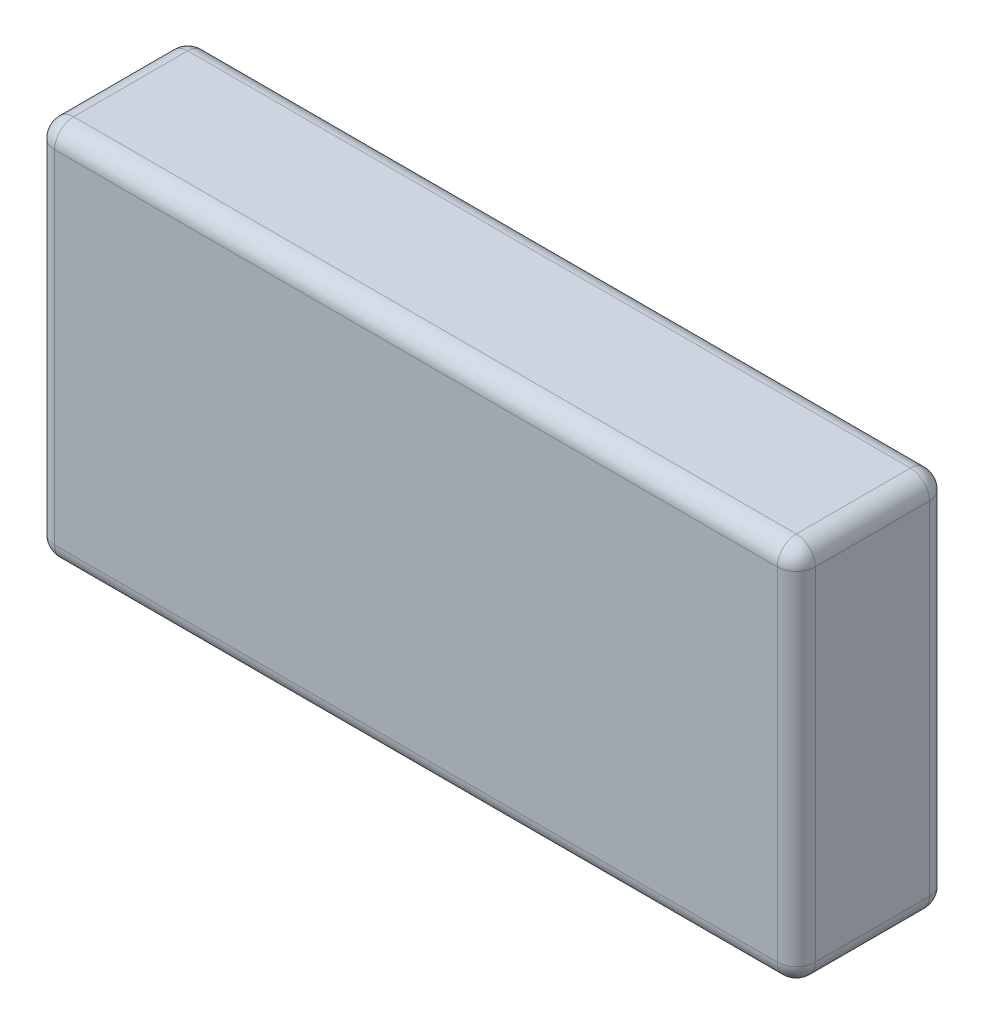
ISO-10303-21;
HEADER;
FILE_DESCRIPTION(('STEP AP214'),'2;1');
FILE_NAME('part.step','',(''),(''),'','','');
FILE_SCHEMA(('AUTOMOTIVE_DESIGN { 1 0 10303 214 1 1 1 1 }'));
ENDSEC;
DATA;
#1=APPLICATION_CONTEXT('core data for automotive mechanical design processes');
#2=APPLICATION_PROTOCOL_DEFINITION('international standard','automotive_design',2000,#1);
#3=PRODUCT_CONTEXT('',#1,'mechanical');
#4=PRODUCT('Part','Part','',(#3));
#5=PRODUCT_RELATED_PRODUCT_CATEGORY('part','',(#4));
#6=PRODUCT_DEFINITION_FORMATION('','',#4);
#7=PRODUCT_DEFINITION_CONTEXT('part definition',#1,'design');
#8=PRODUCT_DEFINITION('design','',#6,#7);
#9=PRODUCT_DEFINITION_SHAPE('','',#8);
#10=(LENGTH_UNIT() NAMED_UNIT(*) SI_UNIT(.MILLI.,.METRE.));
#11=(NAMED_UNIT(*) PLANE_ANGLE_UNIT() SI_UNIT($,.RADIAN.));
#12=(NAMED_UNIT(*) SI_UNIT($,.STERADIAN.) SOLID_ANGLE_UNIT());
#13=UNCERTAINTY_MEASURE_WITH_UNIT(LENGTH_MEASURE(1.E-05),#10,'distance_accuracy_value','');
#14=(GEOMETRIC_REPRESENTATION_CONTEXT(3) GLOBAL_UNCERTAINTY_ASSIGNED_CONTEXT((#13)) GLOBAL_UNIT_ASSIGNED_CONTEXT((#10,
#11,#12)) REPRESENTATION_CONTEXT('',''));
#15=CARTESIAN_POINT('',(0.,0.,0.));
#16=DIRECTION('',(0.,0.,1.));
#17=DIRECTION('',(1.,0.,0.));
#18=AXIS2_PLACEMENT_3D('',#15,#16,#17);
#19=CARTESIAN_POINT('',(5.,5.,-1.));
#20=DIRECTION('',(-1.,0.,0.));
#21=DIRECTION('',(0.,0.,1.));
#22=AXIS2_PLACEMENT_3D('',#19,#20,#21);
#23=PLANE('',#22);
#24=DIRECTION('',(0.,0.,-1.));
#25=VECTOR('',#24,1.);
#26=CARTESIAN_POINT('',(5.,0.25,-1.));
#27=LINE('',#26,#25);
#28=CARTESIAN_POINT('',(5.,0.25,0.75));
#29=VERTEX_POINT('',#28);
#30=CARTESIAN_POINT('',(5.,0.25,-0.75));
#31=VERTEX_POINT('',#30);
#32=EDGE_CURVE('E139',#29,#31,#27,.T.);
#33=ORIENTED_EDGE('',*,*,#32,.T.);
#34=DIRECTION('',(0.,-1.,0.));
#35=VECTOR('',#34,1.);
#36=CARTESIAN_POINT('',(5.,5.,-0.75));
#37=LINE('',#36,#35);
#38=CARTESIAN_POINT('',(5.,4.75,-0.75));
#39=VERTEX_POINT('',#38);
#40=EDGE_CURVE('E135',#31,#39,#37,.F.);
#41=ORIENTED_EDGE('',*,*,#40,.T.);
#42=DIRECTION('',(0.,0.,-1.));
#43=VECTOR('',#42,1.);
#44=CARTESIAN_POINT('',(5.,4.75,1.));
#45=LINE('',#44,#43);
#46=CARTESIAN_POINT('',(5.,4.75,0.75));
#47=VERTEX_POINT('',#46);
#48=EDGE_CURVE('E128',#39,#47,#45,.F.);
#49=ORIENTED_EDGE('',*,*,#48,.T.);
#50=DIRECTION('',(0.,-1.,0.));
#51=VECTOR('',#50,1.);
#52=CARTESIAN_POINT('',(5.,5.,0.75));
#53=LINE('',#52,#51);
#54=EDGE_CURVE('E132',#47,#29,#53,.T.);
#55=ORIENTED_EDGE('',*,*,#54,.T.);
#56=EDGE_LOOP('',(#33,#41,#49,#55));
#57=FACE_BOUND('',#56,.T.);
#58=ADVANCED_FACE('F41',(#57),#23,.F.);
#59=CARTESIAN_POINT('',(-5.,5.,-1.));
#60=DIRECTION('',(0.,0.,1.));
#61=DIRECTION('',(1.,0.,0.));
#62=AXIS2_PLACEMENT_3D('',#59,#60,#61);
#63=PLANE('',#62);
#64=DIRECTION('',(-1.,0.,0.));
#65=VECTOR('',#64,1.);
#66=CARTESIAN_POINT('',(5.,4.75,-1.));
#67=LINE('',#66,#65);
#68=CARTESIAN_POINT('',(-4.75,4.75,-1.));
#69=VERTEX_POINT('',#68);
#70=CARTESIAN_POINT('',(4.75,4.75,-1.));
#71=VERTEX_POINT('',#70);
#72=EDGE_CURVE('E200',#69,#71,#67,.F.);
#73=ORIENTED_EDGE('',*,*,#72,.T.);
#74=DIRECTION('',(0.,-1.,0.));
#75=VECTOR('',#74,1.);
#76=CARTESIAN_POINT('',(4.75,5.,-1.));
#77=LINE('',#76,#75);
#78=CARTESIAN_POINT('',(4.75,0.25,-1.));
#79=VERTEX_POINT('',#78);
#80=EDGE_CURVE('E202',#71,#79,#77,.T.);
#81=ORIENTED_EDGE('',*,*,#80,.T.);
#82=DIRECTION('',(-1.,0.,0.));
#83=VECTOR('',#82,1.);
#84=CARTESIAN_POINT('',(-5.,0.25,-1.));
#85=LINE('',#84,#83);
#86=CARTESIAN_POINT('',(-4.75,0.25,-1.));
#87=VERTEX_POINT('',#86);
#88=EDGE_CURVE('E196',#79,#87,#85,.T.);
#89=ORIENTED_EDGE('',*,*,#88,.T.);
#90=DIRECTION('',(0.,-1.,0.));
#91=VECTOR('',#90,1.);
#92=CARTESIAN_POINT('',(-4.75,5.,-1.));
#93=LINE('',#92,#91);
#94=EDGE_CURVE('E198',#87,#69,#93,.F.);
#95=ORIENTED_EDGE('',*,*,#94,.T.);
#96=EDGE_LOOP('',(#73,#81,#89,#95));
#97=FACE_BOUND('',#96,.T.);
#98=ADVANCED_FACE('F271',(#97),#63,.F.);
#99=CARTESIAN_POINT('',(-5.,5.,-1.));
#100=DIRECTION('',(1.,0.,0.));
#101=DIRECTION('',(0.,0.,-1.));
#102=AXIS2_PLACEMENT_3D('',#99,#100,#101);
#103=PLANE('',#102);
#104=DIRECTION('',(0.,0.,1.));
#105=VECTOR('',#104,1.);
#106=CARTESIAN_POINT('',(-5.,4.75,-1.));
#107=LINE('',#106,#105);
#108=CARTESIAN_POINT('',(-5.,4.75,0.75));
#109=VERTEX_POINT('',#108);
#110=CARTESIAN_POINT('',(-5.,4.75,-0.75));
#111=VERTEX_POINT('',#110);
#112=EDGE_CURVE('E191',#109,#111,#107,.F.);
#113=ORIENTED_EDGE('',*,*,#112,.T.);
#114=DIRECTION('',(0.,-1.,0.));
#115=VECTOR('',#114,1.);
#116=CARTESIAN_POINT('',(-5.,5.,-0.75));
#117=LINE('',#116,#115);
#118=CARTESIAN_POINT('',(-5.,0.25,-0.75));
#119=VERTEX_POINT('',#118);
#120=EDGE_CURVE('E194',#111,#119,#117,.T.);
#121=ORIENTED_EDGE('',*,*,#120,.T.);
#122=DIRECTION('',(0.,0.,1.));
#123=VECTOR('',#122,1.);
#124=CARTESIAN_POINT('',(-5.,0.25,-1.));
#125=LINE('',#124,#123);
#126=CARTESIAN_POINT('',(-5.,0.25,0.75));
#127=VERTEX_POINT('',#126);
#128=EDGE_CURVE('E189',#119,#127,#125,.T.);
#129=ORIENTED_EDGE('',*,*,#128,.T.);
#130=DIRECTION('',(0.,-1.,0.));
#131=VECTOR('',#130,1.);
#132=CARTESIAN_POINT('',(-5.,5.,0.75));
#133=LINE('',#132,#131);
#134=EDGE_CURVE('E187',#127,#109,#133,.F.);
#135=ORIENTED_EDGE('',*,*,#134,.T.);
#136=EDGE_LOOP('',(#113,#121,#129,#135));
#137=FACE_BOUND('',#136,.T.);
#138=ADVANCED_FACE('F280',(#137),#103,.F.);
#139=CARTESIAN_POINT('',(-5.,5.,1.));
#140=DIRECTION('',(0.,0.,-1.));
#141=DIRECTION('',(-1.,0.,0.));
#142=AXIS2_PLACEMENT_3D('',#139,#140,#141);
#143=PLANE('',#142);
#144=DIRECTION('',(1.,0.,0.));
#145=VECTOR('',#144,1.);
#146=CARTESIAN_POINT('',(-5.,4.75,1.));
#147=LINE('',#146,#145);
#148=CARTESIAN_POINT('',(4.75,4.75,1.));
#149=VERTEX_POINT('',#148);
#150=CARTESIAN_POINT('',(-4.75,4.75,1.));
#151=VERTEX_POINT('',#150);
#152=EDGE_CURVE('E50',#149,#151,#147,.F.);
#153=ORIENTED_EDGE('',*,*,#152,.T.);
#154=DIRECTION('',(0.,-1.,0.));
#155=VECTOR('',#154,1.);
#156=CARTESIAN_POINT('',(-4.75,5.,1.));
#157=LINE('',#156,#155);
#158=CARTESIAN_POINT('',(-4.75,0.25,1.));
#159=VERTEX_POINT('',#158);
#160=EDGE_CURVE('E11',#151,#159,#157,.T.);
#161=ORIENTED_EDGE('',*,*,#160,.T.);
#162=DIRECTION('',(1.,0.,0.));
#163=VECTOR('',#162,1.);
#164=CARTESIAN_POINT('',(-5.,0.25,1.));
#165=LINE('',#164,#163);
#166=CARTESIAN_POINT('',(4.75,0.25,1.));
#167=VERTEX_POINT('',#166);
#168=EDGE_CURVE('E205',#159,#167,#165,.T.);
#169=ORIENTED_EDGE('',*,*,#168,.T.);
#170=DIRECTION('',(0.,-1.,0.));
#171=VECTOR('',#170,1.);
#172=CARTESIAN_POINT('',(4.75,5.,1.));
#173=LINE('',#172,#171);
#174=EDGE_CURVE('E61',#167,#149,#173,.F.);
#175=ORIENTED_EDGE('',*,*,#174,.T.);
#176=EDGE_LOOP('',(#153,#161,#169,#175));
#177=FACE_BOUND('',#176,.T.);
#178=ADVANCED_FACE('F295',(#177),#143,.F.);
#179=CARTESIAN_POINT('',(0.,5.,0.));
#180=DIRECTION('',(0.,1.,0.));
#181=DIRECTION('',(0.,0.,1.));
#182=AXIS2_PLACEMENT_3D('',#179,#180,#181);
#183=PLANE('',#182);
#184=DIRECTION('',(0.,0.,-1.));
#185=VECTOR('',#184,1.);
#186=CARTESIAN_POINT('',(4.75,5.,-1.));
#187=LINE('',#186,#185);
#188=CARTESIAN_POINT('',(4.75,5.,0.75));
#189=VERTEX_POINT('',#188);
#190=CARTESIAN_POINT('',(4.75,5.,-0.75));
#191=VERTEX_POINT('',#190);
#192=EDGE_CURVE('E147',#189,#191,#187,.T.);
#193=ORIENTED_EDGE('',*,*,#192,.T.);
#194=DIRECTION('',(-1.,0.,0.));
#195=VECTOR('',#194,1.);
#196=CARTESIAN_POINT('',(-5.,5.,-0.75));
#197=LINE('',#196,#195);
#198=CARTESIAN_POINT('',(-4.75,5.,-0.75));
#199=VERTEX_POINT('',#198);
#200=EDGE_CURVE('E185',#191,#199,#197,.T.);
#201=ORIENTED_EDGE('',*,*,#200,.T.);
#202=DIRECTION('',(0.,0.,1.));
#203=VECTOR('',#202,1.);
#204=CARTESIAN_POINT('',(-4.75,5.,1.));
#205=LINE('',#204,#203);
#206=CARTESIAN_POINT('',(-4.75,5.,0.75));
#207=VERTEX_POINT('',#206);
#208=EDGE_CURVE('E182',#199,#207,#205,.T.);
#209=ORIENTED_EDGE('',*,*,#208,.T.);
#210=DIRECTION('',(1.,0.,0.));
#211=VECTOR('',#210,1.);
#212=CARTESIAN_POINT('',(5.,5.,0.75));
#213=LINE('',#212,#211);
#214=EDGE_CURVE('E180',#207,#189,#213,.T.);
#215=ORIENTED_EDGE('',*,*,#214,.T.);
#216=EDGE_LOOP('',(#193,#201,#209,#215));
#217=FACE_BOUND('',#216,.T.);
#218=ADVANCED_FACE('F483',(#217),#183,.T.);
#219=CARTESIAN_POINT('',(0.,0.,0.));
#220=DIRECTION('',(0.,1.,0.));
#221=DIRECTION('',(0.,0.,1.));
#222=AXIS2_PLACEMENT_3D('',#219,#220,#221);
#223=PLANE('',#222);
#224=DIRECTION('',(0.,0.,1.));
#225=VECTOR('',#224,1.);
#226=CARTESIAN_POINT('',(-4.75,0.,0.));
#227=LINE('',#226,#225);
#228=CARTESIAN_POINT('',(-4.75,0.,0.75));
#229=VERTEX_POINT('',#228);
#230=CARTESIAN_POINT('',(-4.75,0.,-0.75));
#231=VERTEX_POINT('',#230);
#232=EDGE_CURVE('E173',#229,#231,#227,.F.);
#233=ORIENTED_EDGE('',*,*,#232,.T.);
#234=DIRECTION('',(-1.,0.,0.));
#235=VECTOR('',#234,1.);
#236=CARTESIAN_POINT('',(0.,0.,-0.75));
#237=LINE('',#236,#235);
#238=CARTESIAN_POINT('',(4.75,0.,-0.75));
#239=VERTEX_POINT('',#238);
#240=EDGE_CURVE('E178',#231,#239,#237,.F.);
#241=ORIENTED_EDGE('',*,*,#240,.T.);
#242=DIRECTION('',(0.,0.,-1.));
#243=VECTOR('',#242,1.);
#244=CARTESIAN_POINT('',(4.75,0.,0.));
#245=LINE('',#244,#243);
#246=CARTESIAN_POINT('',(4.75,0.,0.75));
#247=VERTEX_POINT('',#246);
#248=EDGE_CURVE('E175',#239,#247,#245,.F.);
#249=ORIENTED_EDGE('',*,*,#248,.T.);
#250=DIRECTION('',(1.,0.,0.));
#251=VECTOR('',#250,1.);
#252=CARTESIAN_POINT('',(0.,0.,0.75));
#253=LINE('',#252,#251);
#254=EDGE_CURVE('E171',#247,#229,#253,.F.);
#255=ORIENTED_EDGE('',*,*,#254,.T.);
#256=EDGE_LOOP('',(#233,#241,#249,#255));
#257=FACE_BOUND('',#256,.T.);
#258=ADVANCED_FACE('F476',(#257),#223,.F.);
#259=CARTESIAN_POINT('',(-4.75,4.75,0.));
#260=DIRECTION('',(0.,0.,-1.));
#261=DIRECTION('',(-1.,0.,0.));
#262=AXIS2_PLACEMENT_3D('',#259,#260,#261);
#263=CYLINDRICAL_SURFACE('',#262,0.25);
#264=CARTESIAN_POINT('',(-4.75,4.75,0.75));
#265=DIRECTION('',(0.,0.,1.));
#266=DIRECTION('',(1.,0.,0.));
#267=AXIS2_PLACEMENT_3D('',#264,#265,#266);
#268=CIRCLE('',#267,0.25);
#269=EDGE_CURVE('E45',#207,#109,#268,.T.);
#270=ORIENTED_EDGE('',*,*,#269,.F.);
#271=ORIENTED_EDGE('',*,*,#208,.F.);
#272=CARTESIAN_POINT('',(-4.75,4.75,-0.75));
#273=DIRECTION('',(0.,0.,-1.));
#274=DIRECTION('',(-1.,0.,0.));
#275=AXIS2_PLACEMENT_3D('',#272,#273,#274);
#276=CIRCLE('',#275,0.25);
#277=EDGE_CURVE('E167',#111,#199,#276,.T.);
#278=ORIENTED_EDGE('',*,*,#277,.F.);
#279=ORIENTED_EDGE('',*,*,#112,.F.);
#280=EDGE_LOOP('',(#270,#271,#278,#279));
#281=FACE_BOUND('',#280,.T.);
#282=ADVANCED_FACE('F43',(#281),#263,.T.);
#283=CARTESIAN_POINT('',(-4.75,4.75,0.75));
#284=DIRECTION('',(-1.,0.,0.));
#285=DIRECTION('',(0.,0.,1.));
#286=AXIS2_PLACEMENT_3D('',#283,#284,#285);
#287=SPHERICAL_SURFACE('',#286,0.25);
#288=CARTESIAN_POINT('',(-4.75,4.75,0.75));
#289=DIRECTION('',(-1.,0.,0.));
#290=DIRECTION('',(0.,0.,1.));
#291=AXIS2_PLACEMENT_3D('',#288,#289,#290);
#292=CIRCLE('',#291,0.25);
#293=EDGE_CURVE('E251',#207,#151,#292,.F.);
#294=ORIENTED_EDGE('',*,*,#293,.F.);
#295=ORIENTED_EDGE('',*,*,#269,.T.);
#296=CARTESIAN_POINT('',(-4.75,4.75,0.75));
#297=DIRECTION('',(0.,1.,0.));
#298=DIRECTION('',(0.,0.,1.));
#299=AXIS2_PLACEMENT_3D('',#296,#297,#298);
#300=CIRCLE('',#299,0.25);
#301=EDGE_CURVE('E253',#151,#109,#300,.F.);
#302=ORIENTED_EDGE('',*,*,#301,.F.);
#303=EDGE_LOOP('',(#294,#295,#302));
#304=FACE_BOUND('',#303,.T.);
#305=ADVANCED_FACE('F461',(#304),#287,.T.);
#306=CARTESIAN_POINT('',(-4.75,4.75,-0.75));
#307=DIRECTION('',(0.,1.,0.));
#308=DIRECTION('',(0.,0.,1.));
#309=AXIS2_PLACEMENT_3D('',#306,#307,#308);
#310=SPHERICAL_SURFACE('',#309,0.25);
#311=CARTESIAN_POINT('',(-4.75,4.75,-0.75));
#312=DIRECTION('',(0.,1.,0.));
#313=DIRECTION('',(0.,0.,1.));
#314=AXIS2_PLACEMENT_3D('',#311,#312,#313);
#315=CIRCLE('',#314,0.25);
#316=EDGE_CURVE('E245',#111,#69,#315,.F.);
#317=ORIENTED_EDGE('',*,*,#316,.F.);
#318=ORIENTED_EDGE('',*,*,#277,.T.);
#319=CARTESIAN_POINT('',(-4.75,4.75,-0.75));
#320=DIRECTION('',(-1.,0.,0.));
#321=DIRECTION('',(0.,0.,1.));
#322=AXIS2_PLACEMENT_3D('',#319,#320,#321);
#323=CIRCLE('',#322,0.25);
#324=EDGE_CURVE('E248',#69,#199,#323,.F.);
#325=ORIENTED_EDGE('',*,*,#324,.F.);
#326=EDGE_LOOP('',(#317,#318,#325));
#327=FACE_BOUND('',#326,.T.);
#328=ADVANCED_FACE('F260',(#327),#310,.T.);
#329=CARTESIAN_POINT('',(-4.75,5.,0.75));
#330=DIRECTION('',(0.,-1.,0.));
#331=DIRECTION('',(0.,0.,-1.));
#332=AXIS2_PLACEMENT_3D('',#329,#330,#331);
#333=CYLINDRICAL_SURFACE('',#332,0.25);
#334=ORIENTED_EDGE('',*,*,#301,.T.);
#335=ORIENTED_EDGE('',*,*,#134,.F.);
#336=CARTESIAN_POINT('',(-4.75,0.25,0.75));
#337=DIRECTION('',(0.,-1.,0.));
#338=DIRECTION('',(0.,0.,-1.));
#339=AXIS2_PLACEMENT_3D('',#336,#337,#338);
#340=CIRCLE('',#339,0.25);
#341=EDGE_CURVE('E239',#159,#127,#340,.T.);
#342=ORIENTED_EDGE('',*,*,#341,.F.);
#343=ORIENTED_EDGE('',*,*,#160,.F.);
#344=EDGE_LOOP('',(#334,#335,#342,#343));
#345=FACE_BOUND('',#344,.T.);
#346=ADVANCED_FACE('F294',(#345),#333,.T.);
#347=CARTESIAN_POINT('',(0.,4.75,0.75));
#348=DIRECTION('',(-1.,0.,0.));
#349=DIRECTION('',(0.,0.,1.));
#350=AXIS2_PLACEMENT_3D('',#347,#348,#349);
#351=CYLINDRICAL_SURFACE('',#350,0.25);
#352=ORIENTED_EDGE('',*,*,#293,.T.);
#353=ORIENTED_EDGE('',*,*,#152,.F.);
#354=CARTESIAN_POINT('',(4.75,4.75,0.75));
#355=DIRECTION('',(1.,0.,0.));
#356=DIRECTION('',(0.,0.,-1.));
#357=AXIS2_PLACEMENT_3D('',#354,#355,#356);
#358=CIRCLE('',#357,0.25);
#359=EDGE_CURVE('E151',#189,#149,#358,.T.);
#360=ORIENTED_EDGE('',*,*,#359,.F.);
#361=ORIENTED_EDGE('',*,*,#214,.F.);
#362=EDGE_LOOP('',(#352,#353,#360,#361));
#363=FACE_BOUND('',#362,.T.);
#364=ADVANCED_FACE('F438',(#363),#351,.T.);
#365=CARTESIAN_POINT('',(4.75,4.75,0.));
#366=DIRECTION('',(0.,0.,1.));
#367=DIRECTION('',(1.,0.,0.));
#368=AXIS2_PLACEMENT_3D('',#365,#366,#367);
#369=CYLINDRICAL_SURFACE('',#368,0.25);
#370=CARTESIAN_POINT('',(4.75,4.75,-0.75));
#371=DIRECTION('',(0.,0.,-1.));
#372=DIRECTION('',(-1.,0.,0.));
#373=AXIS2_PLACEMENT_3D('',#370,#371,#372);
#374=CIRCLE('',#373,0.25);
#375=EDGE_CURVE('E152',#191,#39,#374,.T.);
#376=ORIENTED_EDGE('',*,*,#375,.F.);
#377=ORIENTED_EDGE('',*,*,#192,.F.);
#378=CARTESIAN_POINT('',(4.75,4.75,0.75));
#379=DIRECTION('',(0.,0.,1.));
#380=DIRECTION('',(1.,0.,0.));
#381=AXIS2_PLACEMENT_3D('',#378,#379,#380);
#382=CIRCLE('',#381,0.25);
#383=EDGE_CURVE('E143',#47,#189,#382,.T.);
#384=ORIENTED_EDGE('',*,*,#383,.F.);
#385=ORIENTED_EDGE('',*,*,#48,.F.);
#386=EDGE_LOOP('',(#376,#377,#384,#385));
#387=FACE_BOUND('',#386,.T.);
#388=ADVANCED_FACE('F145',(#387),#369,.T.);
#389=CARTESIAN_POINT('',(0.,4.75,-0.75));
#390=DIRECTION('',(1.,0.,0.));
#391=DIRECTION('',(0.,0.,-1.));
#392=AXIS2_PLACEMENT_3D('',#389,#390,#391);
#393=CYLINDRICAL_SURFACE('',#392,0.25);
#394=ORIENTED_EDGE('',*,*,#324,.T.);
#395=ORIENTED_EDGE('',*,*,#200,.F.);
#396=CARTESIAN_POINT('',(4.75,4.75,-0.75));
#397=DIRECTION('',(1.,0.,0.));
#398=DIRECTION('',(0.,0.,-1.));
#399=AXIS2_PLACEMENT_3D('',#396,#397,#398);
#400=CIRCLE('',#399,0.25);
#401=EDGE_CURVE('E235',#71,#191,#400,.T.);
#402=ORIENTED_EDGE('',*,*,#401,.F.);
#403=ORIENTED_EDGE('',*,*,#72,.F.);
#404=EDGE_LOOP('',(#394,#395,#402,#403));
#405=FACE_BOUND('',#404,.T.);
#406=ADVANCED_FACE('F267',(#405),#393,.T.);
#407=CARTESIAN_POINT('',(-4.75,5.,-0.75));
#408=DIRECTION('',(0.,-1.,0.));
#409=DIRECTION('',(0.,0.,-1.));
#410=AXIS2_PLACEMENT_3D('',#407,#408,#409);
#411=CYLINDRICAL_SURFACE('',#410,0.25);
#412=ORIENTED_EDGE('',*,*,#316,.T.);
#413=ORIENTED_EDGE('',*,*,#94,.F.);
#414=CARTESIAN_POINT('',(-4.75,0.25,-0.75));
#415=DIRECTION('',(0.,-1.,0.));
#416=DIRECTION('',(0.,0.,-1.));
#417=AXIS2_PLACEMENT_3D('',#414,#415,#416);
#418=CIRCLE('',#417,0.25);
#419=EDGE_CURVE('E232',#119,#87,#418,.T.);
#420=ORIENTED_EDGE('',*,*,#419,.F.);
#421=ORIENTED_EDGE('',*,*,#120,.F.);
#422=EDGE_LOOP('',(#412,#413,#420,#421));
#423=FACE_BOUND('',#422,.T.);
#424=ADVANCED_FACE('F277',(#423),#411,.T.);
#425=CARTESIAN_POINT('',(-4.75,0.25,-1.));
#426=DIRECTION('',(0.,0.,1.));
#427=DIRECTION('',(1.,0.,0.));
#428=AXIS2_PLACEMENT_3D('',#425,#426,#427);
#429=CYLINDRICAL_SURFACE('',#428,0.25);
#430=CARTESIAN_POINT('',(-4.75,0.25,0.75));
#431=DIRECTION('',(0.,0.,1.));
#432=DIRECTION('',(1.,0.,0.));
#433=AXIS2_PLACEMENT_3D('',#430,#431,#432);
#434=CIRCLE('',#433,0.25);
#435=EDGE_CURVE('E242',#127,#229,#434,.T.);
#436=ORIENTED_EDGE('',*,*,#435,.F.);
#437=ORIENTED_EDGE('',*,*,#128,.F.);
#438=CARTESIAN_POINT('',(-4.75,0.25,-0.75));
#439=DIRECTION('',(0.,0.,-1.));
#440=DIRECTION('',(-1.,0.,0.));
#441=AXIS2_PLACEMENT_3D('',#438,#439,#440);
#442=CIRCLE('',#441,0.25);
#443=EDGE_CURVE('E229',#231,#119,#442,.T.);
#444=ORIENTED_EDGE('',*,*,#443,.F.);
#445=ORIENTED_EDGE('',*,*,#232,.F.);
#446=EDGE_LOOP('',(#436,#437,#444,#445));
#447=FACE_BOUND('',#446,.T.);
#448=ADVANCED_FACE('F285',(#447),#429,.T.);
#449=CARTESIAN_POINT('',(-4.75,0.25,0.75));
#450=DIRECTION('',(-1.,0.,0.));
#451=DIRECTION('',(0.,-1.,0.));
#452=AXIS2_PLACEMENT_3D('',#449,#450,#451);
#453=SPHERICAL_SURFACE('',#452,0.25);
#454=ORIENTED_EDGE('',*,*,#341,.T.);
#455=ORIENTED_EDGE('',*,*,#435,.T.);
#456=CARTESIAN_POINT('',(-4.75,0.25,0.75));
#457=DIRECTION('',(-1.,0.,0.));
#458=DIRECTION('',(0.,0.,1.));
#459=AXIS2_PLACEMENT_3D('',#456,#457,#458);
#460=CIRCLE('',#459,0.25);
#461=EDGE_CURVE('E158',#159,#229,#460,.F.);
#462=ORIENTED_EDGE('',*,*,#461,.F.);
#463=EDGE_LOOP('',(#454,#455,#462));
#464=FACE_BOUND('',#463,.T.);
#465=ADVANCED_FACE('F291',(#464),#453,.T.);
#466=CARTESIAN_POINT('',(4.75,4.75,0.75));
#467=DIRECTION('',(0.,1.,0.));
#468=DIRECTION('',(0.,0.,1.));
#469=AXIS2_PLACEMENT_3D('',#466,#467,#468);
#470=SPHERICAL_SURFACE('',#469,0.25);
#471=ORIENTED_EDGE('',*,*,#383,.T.);
#472=ORIENTED_EDGE('',*,*,#359,.T.);
#473=CARTESIAN_POINT('',(4.75,4.75,0.75));
#474=DIRECTION('',(0.,1.,0.));
#475=DIRECTION('',(0.,0.,1.));
#476=AXIS2_PLACEMENT_3D('',#473,#474,#475);
#477=CIRCLE('',#476,0.25);
#478=EDGE_CURVE('E155',#47,#149,#477,.F.);
#479=ORIENTED_EDGE('',*,*,#478,.F.);
#480=EDGE_LOOP('',(#471,#472,#479));
#481=FACE_BOUND('',#480,.T.);
#482=ADVANCED_FACE('F156',(#481),#470,.T.);
#483=CARTESIAN_POINT('',(4.75,4.75,-0.75));
#484=DIRECTION('',(0.,1.,0.));
#485=DIRECTION('',(0.,0.,1.));
#486=AXIS2_PLACEMENT_3D('',#483,#484,#485);
#487=SPHERICAL_SURFACE('',#486,0.25);
#488=ORIENTED_EDGE('',*,*,#401,.T.);
#489=ORIENTED_EDGE('',*,*,#375,.T.);
#490=CARTESIAN_POINT('',(4.75,4.75,-0.75));
#491=DIRECTION('',(0.,1.,0.));
#492=DIRECTION('',(0.,0.,1.));
#493=AXIS2_PLACEMENT_3D('',#490,#491,#492);
#494=CIRCLE('',#493,0.25);
#495=EDGE_CURVE('E159',#71,#39,#494,.F.);
#496=ORIENTED_EDGE('',*,*,#495,.F.);
#497=EDGE_LOOP('',(#488,#489,#496));
#498=FACE_BOUND('',#497,.T.);
#499=ADVANCED_FACE('F314',(#498),#487,.T.);
#500=CARTESIAN_POINT('',(-4.75,0.25,-0.75));
#501=DIRECTION('',(-1.,0.,0.));
#502=DIRECTION('',(0.,-1.,0.));
#503=AXIS2_PLACEMENT_3D('',#500,#501,#502);
#504=SPHERICAL_SURFACE('',#503,0.25);
#505=ORIENTED_EDGE('',*,*,#443,.T.);
#506=ORIENTED_EDGE('',*,*,#419,.T.);
#507=CARTESIAN_POINT('',(-4.75,0.25,-0.75));
#508=DIRECTION('',(-1.,0.,0.));
#509=DIRECTION('',(0.,0.,1.));
#510=AXIS2_PLACEMENT_3D('',#507,#508,#509);
#511=CIRCLE('',#510,0.25);
#512=EDGE_CURVE('E222',#231,#87,#511,.F.);
#513=ORIENTED_EDGE('',*,*,#512,.F.);
#514=EDGE_LOOP('',(#505,#506,#513));
#515=FACE_BOUND('',#514,.T.);
#516=ADVANCED_FACE('F316',(#515),#504,.T.);
#517=CARTESIAN_POINT('',(-5.,0.25,0.75));
#518=DIRECTION('',(1.,0.,0.));
#519=DIRECTION('',(0.,0.,-1.));
#520=AXIS2_PLACEMENT_3D('',#517,#518,#519);
#521=CYLINDRICAL_SURFACE('',#520,0.25);
#522=ORIENTED_EDGE('',*,*,#461,.T.);
#523=ORIENTED_EDGE('',*,*,#254,.F.);
#524=CARTESIAN_POINT('',(4.75,0.25,0.75));
#525=DIRECTION('',(1.,0.,0.));
#526=DIRECTION('',(0.,0.,-1.));
#527=AXIS2_PLACEMENT_3D('',#524,#525,#526);
#528=CIRCLE('',#527,0.25);
#529=EDGE_CURVE('E219',#167,#247,#528,.T.);
#530=ORIENTED_EDGE('',*,*,#529,.F.);
#531=ORIENTED_EDGE('',*,*,#168,.F.);
#532=EDGE_LOOP('',(#522,#523,#530,#531));
#533=FACE_BOUND('',#532,.T.);
#534=ADVANCED_FACE('F299',(#533),#521,.T.);
#535=CARTESIAN_POINT('',(4.75,5.,0.75));
#536=DIRECTION('',(0.,-1.,0.));
#537=DIRECTION('',(0.,0.,-1.));
#538=AXIS2_PLACEMENT_3D('',#535,#536,#537);
#539=CYLINDRICAL_SURFACE('',#538,0.25);
#540=ORIENTED_EDGE('',*,*,#478,.T.);
#541=ORIENTED_EDGE('',*,*,#174,.F.);
#542=CARTESIAN_POINT('',(4.75,0.25,0.75));
#543=DIRECTION('',(0.,-1.,0.));
#544=DIRECTION('',(0.,0.,-1.));
#545=AXIS2_PLACEMENT_3D('',#542,#543,#544);
#546=CIRCLE('',#545,0.25);
#547=EDGE_CURVE('E163',#29,#167,#546,.T.);
#548=ORIENTED_EDGE('',*,*,#547,.F.);
#549=ORIENTED_EDGE('',*,*,#54,.F.);
#550=EDGE_LOOP('',(#540,#541,#548,#549));
#551=FACE_BOUND('',#550,.T.);
#552=ADVANCED_FACE('F161',(#551),#539,.T.);
#553=CARTESIAN_POINT('',(4.75,5.,-0.75));
#554=DIRECTION('',(0.,-1.,0.));
#555=DIRECTION('',(0.,0.,-1.));
#556=AXIS2_PLACEMENT_3D('',#553,#554,#555);
#557=CYLINDRICAL_SURFACE('',#556,0.25);
#558=ORIENTED_EDGE('',*,*,#495,.T.);
#559=ORIENTED_EDGE('',*,*,#40,.F.);
#560=CARTESIAN_POINT('',(4.75,0.25,-0.75));
#561=DIRECTION('',(0.,-1.,0.));
#562=DIRECTION('',(0.,0.,-1.));
#563=AXIS2_PLACEMENT_3D('',#560,#561,#562);
#564=CIRCLE('',#563,0.25);
#565=EDGE_CURVE('E215',#79,#31,#564,.T.);
#566=ORIENTED_EDGE('',*,*,#565,.F.);
#567=ORIENTED_EDGE('',*,*,#80,.F.);
#568=EDGE_LOOP('',(#558,#559,#566,#567));
#569=FACE_BOUND('',#568,.T.);
#570=ADVANCED_FACE('F312',(#569),#557,.T.);
#571=CARTESIAN_POINT('',(-5.,0.25,-0.75));
#572=DIRECTION('',(-1.,0.,0.));
#573=DIRECTION('',(0.,0.,1.));
#574=AXIS2_PLACEMENT_3D('',#571,#572,#573);
#575=CYLINDRICAL_SURFACE('',#574,0.25);
#576=ORIENTED_EDGE('',*,*,#512,.T.);
#577=ORIENTED_EDGE('',*,*,#88,.F.);
#578=CARTESIAN_POINT('',(4.75,0.25,-0.75));
#579=DIRECTION('',(1.,0.,0.));
#580=DIRECTION('',(0.,0.,-1.));
#581=AXIS2_PLACEMENT_3D('',#578,#579,#580);
#582=CIRCLE('',#581,0.25);
#583=EDGE_CURVE('E213',#239,#79,#582,.T.);
#584=ORIENTED_EDGE('',*,*,#583,.F.);
#585=ORIENTED_EDGE('',*,*,#240,.F.);
#586=EDGE_LOOP('',(#576,#577,#584,#585));
#587=FACE_BOUND('',#586,.T.);
#588=ADVANCED_FACE('F339',(#587),#575,.T.);
#589=CARTESIAN_POINT('',(4.75,0.25,0.75));
#590=DIRECTION('',(0.,0.,1.));
#591=DIRECTION('',(0.,-1.,0.));
#592=AXIS2_PLACEMENT_3D('',#589,#590,#591);
#593=SPHERICAL_SURFACE('',#592,0.25);
#594=ORIENTED_EDGE('',*,*,#547,.T.);
#595=ORIENTED_EDGE('',*,*,#529,.T.);
#596=CARTESIAN_POINT('',(4.75,0.25,0.75));
#597=DIRECTION('',(0.,0.,1.));
#598=DIRECTION('',(1.,0.,0.));
#599=AXIS2_PLACEMENT_3D('',#596,#597,#598);
#600=CIRCLE('',#599,0.25);
#601=EDGE_CURVE('E211',#29,#247,#600,.F.);
#602=ORIENTED_EDGE('',*,*,#601,.F.);
#603=EDGE_LOOP('',(#594,#595,#602));
#604=FACE_BOUND('',#603,.T.);
#605=ADVANCED_FACE('F301',(#604),#593,.T.);
#606=CARTESIAN_POINT('',(4.75,0.25,-0.75));
#607=DIRECTION('',(0.,0.,-1.));
#608=DIRECTION('',(0.,1.,0.));
#609=AXIS2_PLACEMENT_3D('',#606,#607,#608);
#610=SPHERICAL_SURFACE('',#609,0.25);
#611=ORIENTED_EDGE('',*,*,#583,.T.);
#612=ORIENTED_EDGE('',*,*,#565,.T.);
#613=CARTESIAN_POINT('',(4.75,0.25,-0.75));
#614=DIRECTION('',(0.,0.,-1.));
#615=DIRECTION('',(-1.,0.,0.));
#616=AXIS2_PLACEMENT_3D('',#613,#614,#615);
#617=CIRCLE('',#616,0.25);
#618=EDGE_CURVE('E209',#239,#31,#617,.F.);
#619=ORIENTED_EDGE('',*,*,#618,.F.);
#620=EDGE_LOOP('',(#611,#612,#619));
#621=FACE_BOUND('',#620,.T.);
#622=ADVANCED_FACE('F309',(#621),#610,.T.);
#623=CARTESIAN_POINT('',(4.75,0.25,-1.));
#624=DIRECTION('',(0.,0.,-1.));
#625=DIRECTION('',(-1.,0.,0.));
#626=AXIS2_PLACEMENT_3D('',#623,#624,#625);
#627=CYLINDRICAL_SURFACE('',#626,0.25);
#628=ORIENTED_EDGE('',*,*,#601,.T.);
#629=ORIENTED_EDGE('',*,*,#248,.F.);
#630=ORIENTED_EDGE('',*,*,#618,.T.);
#631=ORIENTED_EDGE('',*,*,#32,.F.);
#632=EDGE_LOOP('',(#628,#629,#630,#631));
#633=FACE_BOUND('',#632,.T.);
#634=ADVANCED_FACE('F305',(#633),#627,.T.);
#635=CLOSED_SHELL('',(#58,#98,#138,#178,#218,#258,#282,#305,#328,#346,#364,#388,#406,#424,#448,
#465,#482,#499,#516,#534,#552,#570,#588,#605,#622,#634));
#636=MANIFOLD_SOLID_BREP('B2',#635);
#637=ADVANCED_BREP_SHAPE_REPRESENTATION('',(#18,#636),#14);
#638=SHAPE_DEFINITION_REPRESENTATION(#9,#637);
ENDSEC;
END-ISO-10303-21;
